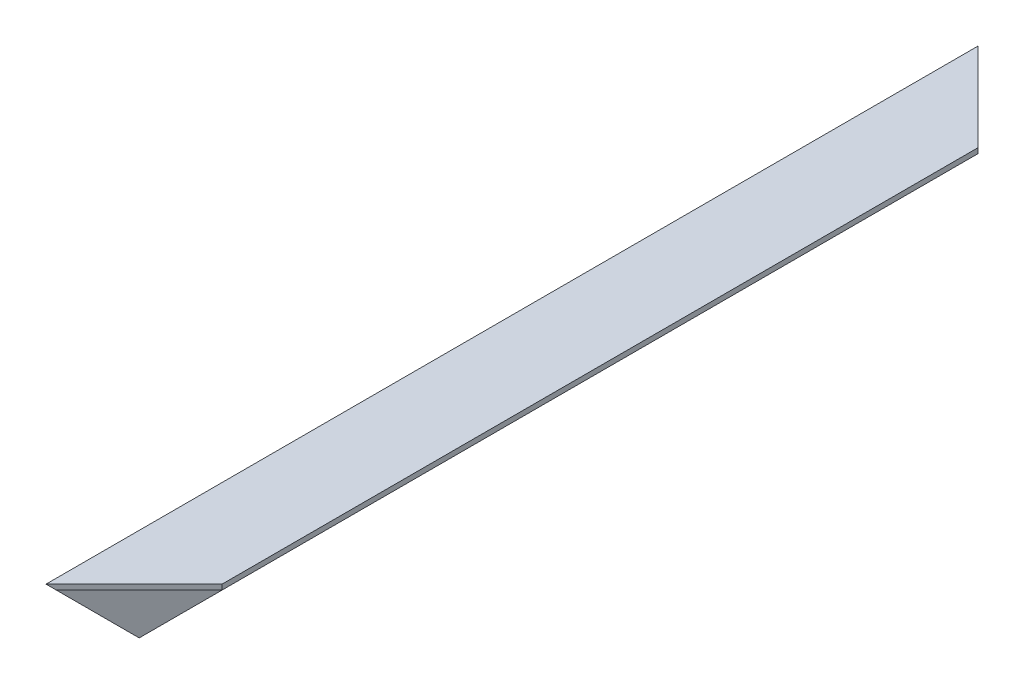
ISO-10303-21;
HEADER;
FILE_DESCRIPTION(('STEP AP214'),'2;1');
FILE_NAME('part.step','',(''),(''),'','','');
FILE_SCHEMA(('AUTOMOTIVE_DESIGN { 1 0 10303 214 1 1 1 1 }'));
ENDSEC;
DATA;
#1=APPLICATION_CONTEXT('core data for automotive mechanical design processes');
#2=APPLICATION_PROTOCOL_DEFINITION('international standard','automotive_design',2000,#1);
#3=PRODUCT_CONTEXT('',#1,'mechanical');
#4=PRODUCT('Part','Part','',(#3));
#5=PRODUCT_RELATED_PRODUCT_CATEGORY('part','',(#4));
#6=PRODUCT_DEFINITION_FORMATION('','',#4);
#7=PRODUCT_DEFINITION_CONTEXT('part definition',#1,'design');
#8=PRODUCT_DEFINITION('design','',#6,#7);
#9=PRODUCT_DEFINITION_SHAPE('','',#8);
#10=(LENGTH_UNIT() NAMED_UNIT(*) SI_UNIT(.MILLI.,.METRE.));
#11=(NAMED_UNIT(*) PLANE_ANGLE_UNIT() SI_UNIT($,.RADIAN.));
#12=(NAMED_UNIT(*) SI_UNIT($,.STERADIAN.) SOLID_ANGLE_UNIT());
#13=UNCERTAINTY_MEASURE_WITH_UNIT(LENGTH_MEASURE(1.E-05),#10,'distance_accuracy_value','');
#14=(GEOMETRIC_REPRESENTATION_CONTEXT(3) GLOBAL_UNCERTAINTY_ASSIGNED_CONTEXT((#13)) GLOBAL_UNIT_ASSIGNED_CONTEXT((#10,
#11,#12)) REPRESENTATION_CONTEXT('',''));
#15=CARTESIAN_POINT('',(0.,0.,0.));
#16=DIRECTION('',(0.,0.,1.));
#17=DIRECTION('',(1.,0.,0.));
#18=AXIS2_PLACEMENT_3D('',#15,#16,#17);
#19=CARTESIAN_POINT('',(-17.9063367596535,-22.3164946446273,225.));
#20=DIRECTION('',(0.,1.,0.));
#21=DIRECTION('',(0.,0.,1.));
#22=AXIS2_PLACEMENT_3D('',#19,#20,#21);
#23=PLANE('',#22);
#24=DIRECTION('',(0.,0.,-1.));
#25=VECTOR('',#24,1.);
#26=CARTESIAN_POINT('',(-17.9063367596535,-22.3164946446273,225.));
#27=LINE('',#26,#25);
#28=CARTESIAN_POINT('',(-17.9063367596535,-22.3164946446272,182.5));
#29=VERTEX_POINT('',#28);
#30=CARTESIAN_POINT('',(-17.9063367596535,-22.3164946446273,-182.5));
#31=VERTEX_POINT('',#30);
#32=EDGE_CURVE('E119',#29,#31,#27,.T.);
#33=ORIENTED_EDGE('',*,*,#32,.T.);
#34=DIRECTION('',(-1.,0.,0.));
#35=VECTOR('',#34,1.);
#36=CARTESIAN_POINT('',(24.5936632403465,-22.3164946446273,-182.5));
#37=LINE('',#36,#35);
#38=CARTESIAN_POINT('',(-15.4063367596535,-22.3164946446273,-182.5));
#39=VERTEX_POINT('',#38);
#40=EDGE_CURVE('E94',#39,#31,#37,.T.);
#41=ORIENTED_EDGE('',*,*,#40,.F.);
#42=DIRECTION('',(0.,0.,-1.));
#43=VECTOR('',#42,1.);
#44=CARTESIAN_POINT('',(-15.4063367596535,-22.3164946446273,225.));
#45=LINE('',#44,#43);
#46=CARTESIAN_POINT('',(-15.4063367596535,-22.3164946446272,182.5));
#47=VERTEX_POINT('',#46);
#48=EDGE_CURVE('E101',#47,#39,#45,.T.);
#49=ORIENTED_EDGE('',*,*,#48,.F.);
#50=DIRECTION('',(-1.,0.,0.));
#51=VECTOR('',#50,1.);
#52=CARTESIAN_POINT('',(24.5936632403465,-22.3164946446272,182.5));
#53=LINE('',#52,#51);
#54=EDGE_CURVE('E86',#47,#29,#53,.T.);
#55=ORIENTED_EDGE('',*,*,#54,.T.);
#56=EDGE_LOOP('',(#33,#41,#49,#55));
#57=FACE_BOUND('',#56,.T.);
#58=ADVANCED_FACE('F35',(#57),#23,.F.);
#59=CARTESIAN_POINT('',(-15.4063367596535,-22.3164946446273,225.));
#60=DIRECTION('',(-1.,0.,0.));
#61=DIRECTION('',(0.,-1.,0.));
#62=AXIS2_PLACEMENT_3D('',#59,#60,#61);
#63=PLANE('',#62);
#64=ORIENTED_EDGE('',*,*,#48,.T.);
#65=DIRECTION('',(0.,0.707106781186548,-0.707106781186548));
#66=VECTOR('',#65,1.);
#67=CARTESIAN_POINT('',(-15.4063367596535,-226.066494644627,21.25));
#68=LINE('',#67,#66);
#69=CARTESIAN_POINT('',(-15.4063367596535,17.6835053553728,-222.5));
#70=VERTEX_POINT('',#69);
#71=EDGE_CURVE('E134',#39,#70,#68,.T.);
#72=ORIENTED_EDGE('',*,*,#71,.T.);
#73=DIRECTION('',(0.,0.,-1.));
#74=VECTOR('',#73,1.);
#75=CARTESIAN_POINT('',(-15.4063367596535,17.6835053553727,225.));
#76=LINE('',#75,#74);
#77=CARTESIAN_POINT('',(-15.4063367596535,17.6835053553727,222.5));
#78=VERTEX_POINT('',#77);
#79=EDGE_CURVE('E103',#78,#70,#76,.T.);
#80=ORIENTED_EDGE('',*,*,#79,.F.);
#81=DIRECTION('',(0.,-0.707106781186548,-0.707106781186547));
#82=VECTOR('',#81,1.);
#83=CARTESIAN_POINT('',(-15.4063367596535,-1.06649464462726,203.75));
#84=LINE('',#83,#82);
#85=EDGE_CURVE('E49',#78,#47,#84,.T.);
#86=ORIENTED_EDGE('',*,*,#85,.T.);
#87=EDGE_LOOP('',(#64,#72,#80,#86));
#88=FACE_BOUND('',#87,.T.);
#89=ADVANCED_FACE('F99',(#88),#63,.F.);
#90=CARTESIAN_POINT('',(-15.4063367596535,17.6835053553727,225.));
#91=DIRECTION('',(0.,1.,0.));
#92=DIRECTION('',(0.,0.,1.));
#93=AXIS2_PLACEMENT_3D('',#90,#91,#92);
#94=PLANE('',#93);
#95=ORIENTED_EDGE('',*,*,#79,.T.);
#96=DIRECTION('',(0.707106781186547,0.,0.707106781186548));
#97=VECTOR('',#96,1.);
#98=CARTESIAN_POINT('',(208.343663240346,17.6835053553727,1.25000000000008));
#99=LINE('',#98,#97);
#100=CARTESIAN_POINT('',(24.5936632403465,17.6835053553727,-182.5));
#101=VERTEX_POINT('',#100);
#102=EDGE_CURVE('E126',#70,#101,#99,.T.);
#103=ORIENTED_EDGE('',*,*,#102,.T.);
#104=DIRECTION('',(0.,0.,-1.));
#105=VECTOR('',#104,1.);
#106=CARTESIAN_POINT('',(24.5936632403465,17.6835053553727,225.));
#107=LINE('',#106,#105);
#108=CARTESIAN_POINT('',(24.5936632403465,17.6835053553727,182.5));
#109=VERTEX_POINT('',#108);
#110=EDGE_CURVE('E108',#109,#101,#107,.T.);
#111=ORIENTED_EDGE('',*,*,#110,.F.);
#112=DIRECTION('',(-0.707106781186547,0.,0.707106781186548));
#113=VECTOR('',#112,1.);
#114=CARTESIAN_POINT('',(-16.6563367596535,17.6835053553727,223.75));
#115=LINE('',#114,#113);
#116=EDGE_CURVE('E121',#109,#78,#115,.T.);
#117=ORIENTED_EDGE('',*,*,#116,.T.);
#118=EDGE_LOOP('',(#95,#103,#111,#117));
#119=FACE_BOUND('',#118,.T.);
#120=ADVANCED_FACE('F156',(#119),#94,.F.);
#121=CARTESIAN_POINT('',(24.5936632403465,17.6835053553727,225.));
#122=DIRECTION('',(-1.,0.,0.));
#123=DIRECTION('',(0.,0.,1.));
#124=AXIS2_PLACEMENT_3D('',#121,#122,#123);
#125=PLANE('',#124);
#126=ORIENTED_EDGE('',*,*,#110,.T.);
#127=DIRECTION('',(0.,1.,0.));
#128=VECTOR('',#127,1.);
#129=CARTESIAN_POINT('',(24.5936632403465,-22.3164946446273,-182.5));
#130=LINE('',#129,#128);
#131=CARTESIAN_POINT('',(24.5936632403465,20.1835053553727,-182.5));
#132=VERTEX_POINT('',#131);
#133=EDGE_CURVE('E132',#101,#132,#130,.T.);
#134=ORIENTED_EDGE('',*,*,#133,.T.);
#135=DIRECTION('',(0.,0.,-1.));
#136=VECTOR('',#135,1.);
#137=CARTESIAN_POINT('',(24.5936632403465,20.1835053553727,225.));
#138=LINE('',#137,#136);
#139=CARTESIAN_POINT('',(24.5936632403465,20.1835053553727,182.5));
#140=VERTEX_POINT('',#139);
#141=EDGE_CURVE('E113',#140,#132,#138,.T.);
#142=ORIENTED_EDGE('',*,*,#141,.F.);
#143=DIRECTION('',(0.,1.,0.));
#144=VECTOR('',#143,1.);
#145=CARTESIAN_POINT('',(24.5936632403465,-22.3164946446273,182.5));
#146=LINE('',#145,#144);
#147=EDGE_CURVE('E57',#109,#140,#146,.T.);
#148=ORIENTED_EDGE('',*,*,#147,.F.);
#149=EDGE_LOOP('',(#126,#134,#142,#148));
#150=FACE_BOUND('',#149,.T.);
#151=ADVANCED_FACE('F153',(#150),#125,.F.);
#152=CARTESIAN_POINT('',(24.5936632403465,20.1835053553727,225.));
#153=DIRECTION('',(0.,-1.,0.));
#154=DIRECTION('',(1.,0.,0.));
#155=AXIS2_PLACEMENT_3D('',#152,#153,#154);
#156=PLANE('',#155);
#157=ORIENTED_EDGE('',*,*,#141,.T.);
#158=DIRECTION('',(-0.707106781186547,0.,-0.707106781186548));
#159=VECTOR('',#158,1.);
#160=CARTESIAN_POINT('',(228.343663240346,20.1835053553728,21.2500000000001));
#161=LINE('',#160,#159);
#162=CARTESIAN_POINT('',(-17.9063367596535,20.1835053553727,-225.));
#163=VERTEX_POINT('',#162);
#164=EDGE_CURVE('E129',#132,#163,#161,.T.);
#165=ORIENTED_EDGE('',*,*,#164,.T.);
#166=DIRECTION('',(0.,0.,-1.));
#167=VECTOR('',#166,1.);
#168=CARTESIAN_POINT('',(-17.9063367596535,20.1835053553727,225.));
#169=LINE('',#168,#167);
#170=CARTESIAN_POINT('',(-17.9063367596535,20.1835053553728,225.));
#171=VERTEX_POINT('',#170);
#172=EDGE_CURVE('E116',#171,#163,#169,.T.);
#173=ORIENTED_EDGE('',*,*,#172,.F.);
#174=DIRECTION('',(0.707106781186547,0.,-0.707106781186548));
#175=VECTOR('',#174,1.);
#176=CARTESIAN_POINT('',(3.34366324034647,20.1835053553727,203.75));
#177=LINE('',#176,#175);
#178=EDGE_CURVE('E124',#171,#140,#177,.T.);
#179=ORIENTED_EDGE('',*,*,#178,.T.);
#180=EDGE_LOOP('',(#157,#165,#173,#179));
#181=FACE_BOUND('',#180,.T.);
#182=ADVANCED_FACE('F147',(#181),#156,.F.);
#183=CARTESIAN_POINT('',(-17.9063367596535,20.1835053553727,225.));
#184=DIRECTION('',(1.,0.,0.));
#185=DIRECTION('',(0.,1.,0.));
#186=AXIS2_PLACEMENT_3D('',#183,#184,#185);
#187=PLANE('',#186);
#188=ORIENTED_EDGE('',*,*,#172,.T.);
#189=DIRECTION('',(0.,-0.707106781186548,0.707106781186548));
#190=VECTOR('',#189,1.);
#191=CARTESIAN_POINT('',(-17.9063367596535,-204.816494644627,0.));
#192=LINE('',#191,#190);
#193=EDGE_CURVE('E104',#163,#31,#192,.T.);
#194=ORIENTED_EDGE('',*,*,#193,.T.);
#195=ORIENTED_EDGE('',*,*,#32,.F.);
#196=DIRECTION('',(0.,0.707106781186548,0.707106781186547));
#197=VECTOR('',#196,1.);
#198=CARTESIAN_POINT('',(-17.9063367596535,20.1835053553727,225.));
#199=LINE('',#198,#197);
#200=EDGE_CURVE('E89',#29,#171,#199,.T.);
#201=ORIENTED_EDGE('',*,*,#200,.T.);
#202=EDGE_LOOP('',(#188,#194,#195,#201));
#203=FACE_BOUND('',#202,.T.);
#204=ADVANCED_FACE('F144',(#203),#187,.F.);
#205=CARTESIAN_POINT('',(-17.9063367596535,-22.3164946446273,-225.));
#206=DIRECTION('',(-0.707106781186548,0.,0.707106781186547));
#207=DIRECTION('',(0.707106781186547,0.,0.707106781186548));
#208=AXIS2_PLACEMENT_3D('',#205,#206,#207);
#209=PLANE('',#208);
#210=ORIENTED_EDGE('',*,*,#102,.F.);
#211=DIRECTION('',(-0.577350269189626,0.577350269189626,-0.577350269189626));
#212=VECTOR('',#211,1.);
#213=CARTESIAN_POINT('',(-3.73967009298686,6.01683868870608,-210.833333333333));
#214=LINE('',#213,#212);
#215=EDGE_CURVE('E11',#70,#163,#214,.T.);
#216=ORIENTED_EDGE('',*,*,#215,.T.);
#217=ORIENTED_EDGE('',*,*,#164,.F.);
#218=ORIENTED_EDGE('',*,*,#133,.F.);
#219=EDGE_LOOP('',(#210,#216,#217,#218));
#220=FACE_BOUND('',#219,.T.);
#221=ADVANCED_FACE('F151',(#220),#209,.F.);
#222=CARTESIAN_POINT('',(-17.9063367596535,-22.3164946446273,225.));
#223=DIRECTION('',(-0.707106781186548,0.,-0.707106781186547));
#224=DIRECTION('',(-0.707106781186547,0.,0.707106781186548));
#225=AXIS2_PLACEMENT_3D('',#222,#223,#224);
#226=PLANE('',#225);
#227=ORIENTED_EDGE('',*,*,#178,.F.);
#228=DIRECTION('',(0.577350269189626,-0.577350269189626,-0.577350269189626));
#229=VECTOR('',#228,1.);
#230=CARTESIAN_POINT('',(-3.73967009298683,6.01683868870608,210.833333333333));
#231=LINE('',#230,#229);
#232=EDGE_CURVE('E42',#171,#78,#231,.T.);
#233=ORIENTED_EDGE('',*,*,#232,.T.);
#234=ORIENTED_EDGE('',*,*,#116,.F.);
#235=ORIENTED_EDGE('',*,*,#147,.T.);
#236=EDGE_LOOP('',(#227,#233,#234,#235));
#237=FACE_BOUND('',#236,.T.);
#238=ADVANCED_FACE('F157',(#237),#226,.F.);
#239=CARTESIAN_POINT('',(24.5936632403465,20.1835053553728,225.));
#240=DIRECTION('',(0.,0.707106781186547,-0.707106781186548));
#241=DIRECTION('',(0.,0.707106781186548,0.707106781186547));
#242=AXIS2_PLACEMENT_3D('',#239,#240,#241);
#243=PLANE('',#242);
#244=ORIENTED_EDGE('',*,*,#232,.F.);
#245=ORIENTED_EDGE('',*,*,#200,.F.);
#246=ORIENTED_EDGE('',*,*,#54,.F.);
#247=ORIENTED_EDGE('',*,*,#85,.F.);
#248=EDGE_LOOP('',(#244,#245,#246,#247));
#249=FACE_BOUND('',#248,.T.);
#250=ADVANCED_FACE('F87',(#249),#243,.F.);
#251=CARTESIAN_POINT('',(24.5936632403465,20.1835053553728,-225.));
#252=DIRECTION('',(0.,0.707106781186548,0.707106781186548));
#253=DIRECTION('',(0.,-0.707106781186548,0.707106781186548));
#254=AXIS2_PLACEMENT_3D('',#251,#252,#253);
#255=PLANE('',#254);
#256=ORIENTED_EDGE('',*,*,#40,.T.);
#257=ORIENTED_EDGE('',*,*,#193,.F.);
#258=ORIENTED_EDGE('',*,*,#215,.F.);
#259=ORIENTED_EDGE('',*,*,#71,.F.);
#260=EDGE_LOOP('',(#256,#257,#258,#259));
#261=FACE_BOUND('',#260,.T.);
#262=ADVANCED_FACE('F142',(#261),#255,.F.);
#263=CLOSED_SHELL('',(#58,#89,#120,#151,#182,#204,#221,#238,#250,#262));
#264=MANIFOLD_SOLID_BREP('B2',#263);
#265=ADVANCED_BREP_SHAPE_REPRESENTATION('',(#18,#264),#14);
#266=SHAPE_DEFINITION_REPRESENTATION(#9,#265);
ENDSEC;
END-ISO-10303-21;
